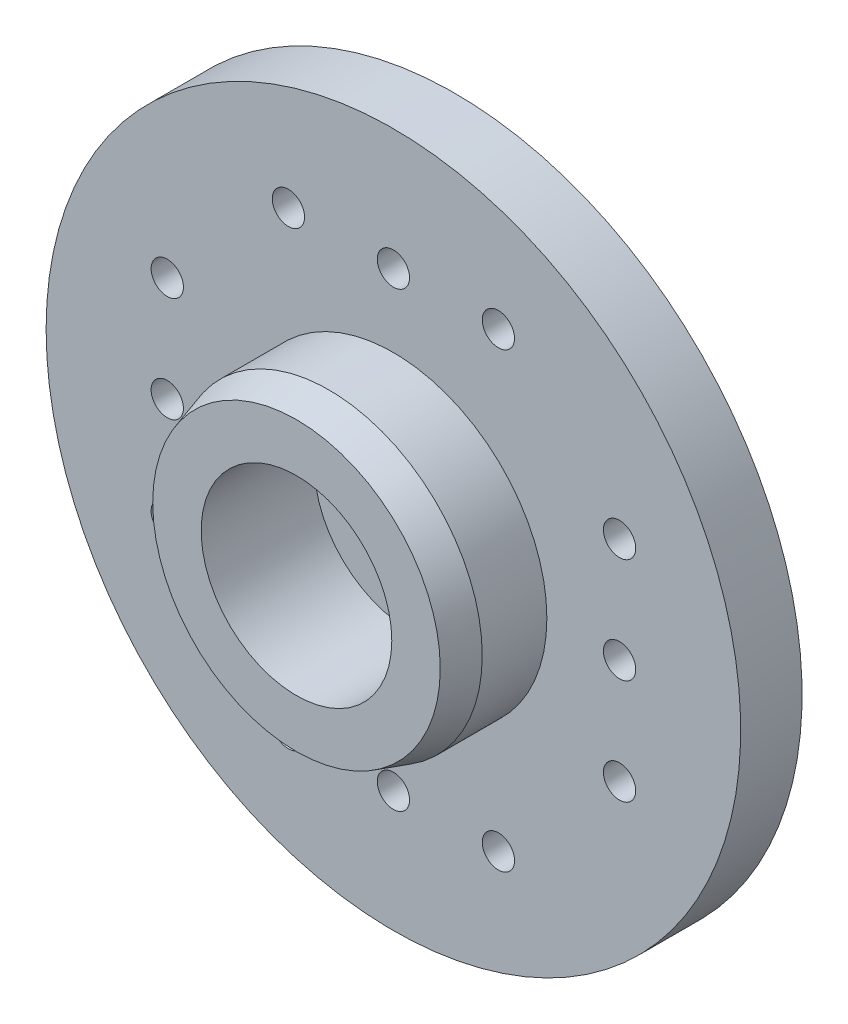
ISO-10303-21;
HEADER;
FILE_DESCRIPTION(('STEP AP214'),'2;1');
FILE_NAME('part.step','',(''),(''),'','','');
FILE_SCHEMA(('AUTOMOTIVE_DESIGN { 1 0 10303 214 1 1 1 1 }'));
ENDSEC;
DATA;
#1=APPLICATION_CONTEXT('core data for automotive mechanical design processes');
#2=APPLICATION_PROTOCOL_DEFINITION('international standard','automotive_design',2000,#1);
#3=PRODUCT_CONTEXT('',#1,'mechanical');
#4=PRODUCT('Part','Part','',(#3));
#5=PRODUCT_RELATED_PRODUCT_CATEGORY('part','',(#4));
#6=PRODUCT_DEFINITION_FORMATION('','',#4);
#7=PRODUCT_DEFINITION_CONTEXT('part definition',#1,'design');
#8=PRODUCT_DEFINITION('design','',#6,#7);
#9=PRODUCT_DEFINITION_SHAPE('','',#8);
#10=(LENGTH_UNIT() NAMED_UNIT(*) SI_UNIT(.MILLI.,.METRE.));
#11=(NAMED_UNIT(*) PLANE_ANGLE_UNIT() SI_UNIT($,.RADIAN.));
#12=(NAMED_UNIT(*) SI_UNIT($,.STERADIAN.) SOLID_ANGLE_UNIT());
#13=UNCERTAINTY_MEASURE_WITH_UNIT(LENGTH_MEASURE(1.E-05),#10,'distance_accuracy_value','');
#14=(GEOMETRIC_REPRESENTATION_CONTEXT(3) GLOBAL_UNCERTAINTY_ASSIGNED_CONTEXT((#13)) GLOBAL_UNIT_ASSIGNED_CONTEXT((#10,
#11,#12)) REPRESENTATION_CONTEXT('',''));
#15=CARTESIAN_POINT('',(0.,0.,0.));
#16=DIRECTION('',(0.,0.,1.));
#17=DIRECTION('',(1.,0.,0.));
#18=AXIS2_PLACEMENT_3D('',#15,#16,#17);
#19=CARTESIAN_POINT('',(0.,0.,0.));
#20=DIRECTION('',(0.,0.,1.));
#21=DIRECTION('',(1.,0.,0.));
#22=AXIS2_PLACEMENT_3D('',#19,#20,#21);
#23=PLANE('',#22);
#24=CARTESIAN_POINT('',(0.,0.,0.));
#25=DIRECTION('',(0.,0.,-1.));
#26=DIRECTION('',(-1.,0.,0.));
#27=AXIS2_PLACEMENT_3D('',#24,#25,#26);
#28=CIRCLE('',#27,4.25);
#29=CARTESIAN_POINT('',(-4.25,0.,0.));
#30=VERTEX_POINT('',#29);
#31=EDGE_CURVE('E140',#30,#30,#28,.T.);
#32=ORIENTED_EDGE('',*,*,#31,.F.);
#33=EDGE_LOOP('',(#32));
#34=FACE_BOUND('',#33,.T.);
#35=CARTESIAN_POINT('',(-6.99999999999931,3.24999999999949,0.));
#36=DIRECTION('',(0.,0.,1.));
#37=DIRECTION('',(1.,0.,0.));
#38=AXIS2_PLACEMENT_3D('',#35,#36,#37);
#39=CIRCLE('',#38,0.500000000000001);
#40=CARTESIAN_POINT('',(-6.49999999999931,3.24999999999949,0.));
#41=VERTEX_POINT('',#40);
#42=EDGE_CURVE('E110',#41,#41,#39,.T.);
#43=ORIENTED_EDGE('',*,*,#42,.T.);
#44=EDGE_LOOP('',(#43));
#45=FACE_BOUND('',#44,.T.);
#46=CARTESIAN_POINT('',(-6.99999999999931,-5.14291058676828E-13,0.));
#47=DIRECTION('',(0.,0.,1.));
#48=DIRECTION('',(1.,0.,0.));
#49=AXIS2_PLACEMENT_3D('',#46,#47,#48);
#50=CIRCLE('',#49,0.500000000000001);
#51=CARTESIAN_POINT('',(-6.4999999999993,-5.14291058676828E-13,0.));
#52=VERTEX_POINT('',#51);
#53=EDGE_CURVE('E104',#52,#52,#50,.T.);
#54=ORIENTED_EDGE('',*,*,#53,.T.);
#55=EDGE_LOOP('',(#54));
#56=FACE_BOUND('',#55,.T.);
#57=CARTESIAN_POINT('',(-6.9999999999993,-3.25000000000051,0.));
#58=DIRECTION('',(0.,0.,1.));
#59=DIRECTION('',(1.,0.,0.));
#60=AXIS2_PLACEMENT_3D('',#57,#58,#59);
#61=CIRCLE('',#60,0.5);
#62=CARTESIAN_POINT('',(-6.4999999999993,-3.25000000000051,0.));
#63=VERTEX_POINT('',#62);
#64=EDGE_CURVE('E98',#63,#63,#61,.T.);
#65=ORIENTED_EDGE('',*,*,#64,.T.);
#66=EDGE_LOOP('',(#65));
#67=FACE_BOUND('',#66,.T.);
#68=CARTESIAN_POINT('',(-3.24999999999879,-6.99999999999982,0.));
#69=DIRECTION('',(0.,0.,1.));
#70=DIRECTION('',(1.,0.,0.));
#71=AXIS2_PLACEMENT_3D('',#68,#69,#70);
#72=CIRCLE('',#71,0.5);
#73=CARTESIAN_POINT('',(-2.74999999999879,-6.99999999999982,0.));
#74=VERTEX_POINT('',#73);
#75=EDGE_CURVE('E92',#74,#74,#72,.T.);
#76=ORIENTED_EDGE('',*,*,#75,.T.);
#77=EDGE_LOOP('',(#76));
#78=FACE_BOUND('',#77,.T.);
#79=CARTESIAN_POINT('',(1.20901357681241E-12,-6.99999999999982,0.));
#80=DIRECTION('',(0.,0.,1.));
#81=DIRECTION('',(1.,0.,0.));
#82=AXIS2_PLACEMENT_3D('',#79,#80,#81);
#83=CIRCLE('',#82,0.5);
#84=CARTESIAN_POINT('',(0.500000000001209,-6.99999999999982,0.));
#85=VERTEX_POINT('',#84);
#86=EDGE_CURVE('E86',#85,#85,#83,.T.);
#87=ORIENTED_EDGE('',*,*,#86,.T.);
#88=EDGE_LOOP('',(#87));
#89=FACE_BOUND('',#88,.T.);
#90=CARTESIAN_POINT('',(3.25000000000121,-6.99999999999982,0.));
#91=DIRECTION('',(0.,0.,1.));
#92=DIRECTION('',(1.,0.,0.));
#93=AXIS2_PLACEMENT_3D('',#90,#91,#92);
#94=CIRCLE('',#93,0.5);
#95=CARTESIAN_POINT('',(3.75000000000121,-6.99999999999982,0.));
#96=VERTEX_POINT('',#95);
#97=EDGE_CURVE('E80',#96,#96,#94,.T.);
#98=ORIENTED_EDGE('',*,*,#97,.T.);
#99=EDGE_LOOP('',(#98));
#100=FACE_BOUND('',#99,.T.);
#101=CARTESIAN_POINT('',(7.00000000000051,-3.2499999999993,0.));
#102=DIRECTION('',(0.,0.,1.));
#103=DIRECTION('',(1.,0.,0.));
#104=AXIS2_PLACEMENT_3D('',#101,#102,#103);
#105=CIRCLE('',#104,0.5);
#106=CARTESIAN_POINT('',(7.50000000000051,-3.2499999999993,0.));
#107=VERTEX_POINT('',#106);
#108=EDGE_CURVE('E74',#107,#107,#105,.T.);
#109=ORIENTED_EDGE('',*,*,#108,.T.);
#110=EDGE_LOOP('',(#109));
#111=FACE_BOUND('',#110,.T.);
#112=CARTESIAN_POINT('',(7.00000000000051,6.9557977089499E-13,0.));
#113=DIRECTION('',(0.,0.,1.));
#114=DIRECTION('',(1.,0.,0.));
#115=AXIS2_PLACEMENT_3D('',#112,#113,#114);
#116=CIRCLE('',#115,0.5);
#117=CARTESIAN_POINT('',(7.50000000000051,6.9557977089499E-13,0.));
#118=VERTEX_POINT('',#117);
#119=EDGE_CURVE('E68',#118,#118,#116,.T.);
#120=ORIENTED_EDGE('',*,*,#119,.T.);
#121=EDGE_LOOP('',(#120));
#122=FACE_BOUND('',#121,.T.);
#123=CARTESIAN_POINT('',(7.00000000000051,3.2500000000007,0.));
#124=DIRECTION('',(0.,0.,1.));
#125=DIRECTION('',(1.,0.,0.));
#126=AXIS2_PLACEMENT_3D('',#123,#124,#125);
#127=CIRCLE('',#126,0.500000000000001);
#128=CARTESIAN_POINT('',(7.50000000000051,3.2500000000007,0.));
#129=VERTEX_POINT('',#128);
#130=EDGE_CURVE('E62',#129,#129,#127,.T.);
#131=ORIENTED_EDGE('',*,*,#130,.T.);
#132=EDGE_LOOP('',(#131));
#133=FACE_BOUND('',#132,.T.);
#134=CARTESIAN_POINT('',(3.25,7.,0.));
#135=DIRECTION('',(0.,0.,1.));
#136=DIRECTION('',(1.,0.,0.));
#137=AXIS2_PLACEMENT_3D('',#134,#135,#136);
#138=CIRCLE('',#137,0.5);
#139=CARTESIAN_POINT('',(3.75,7.,0.));
#140=VERTEX_POINT('',#139);
#141=EDGE_CURVE('E56',#140,#140,#138,.T.);
#142=ORIENTED_EDGE('',*,*,#141,.T.);
#143=EDGE_LOOP('',(#142));
#144=FACE_BOUND('',#143,.T.);
#145=CARTESIAN_POINT('',(0.,7.,0.));
#146=DIRECTION('',(0.,0.,1.));
#147=DIRECTION('',(1.,0.,0.));
#148=AXIS2_PLACEMENT_3D('',#145,#146,#147);
#149=CIRCLE('',#148,0.5);
#150=CARTESIAN_POINT('',(0.5,7.,0.));
#151=VERTEX_POINT('',#150);
#152=EDGE_CURVE('E50',#151,#151,#149,.T.);
#153=ORIENTED_EDGE('',*,*,#152,.T.);
#154=EDGE_LOOP('',(#153));
#155=FACE_BOUND('',#154,.T.);
#156=CARTESIAN_POINT('',(-3.25,7.,0.));
#157=DIRECTION('',(0.,0.,1.));
#158=DIRECTION('',(1.,0.,0.));
#159=AXIS2_PLACEMENT_3D('',#156,#157,#158);
#160=CIRCLE('',#159,0.5);
#161=CARTESIAN_POINT('',(-2.75,7.,0.));
#162=VERTEX_POINT('',#161);
#163=EDGE_CURVE('E44',#162,#162,#160,.T.);
#164=ORIENTED_EDGE('',*,*,#163,.T.);
#165=EDGE_LOOP('',(#164));
#166=FACE_BOUND('',#165,.T.);
#167=CARTESIAN_POINT('',(0.,0.,0.));
#168=DIRECTION('',(0.,0.,1.));
#169=DIRECTION('',(1.,0.,0.));
#170=AXIS2_PLACEMENT_3D('',#167,#168,#169);
#171=CIRCLE('',#170,10.75);
#172=CARTESIAN_POINT('',(-10.75,0.,0.));
#173=VERTEX_POINT('',#172);
#174=EDGE_CURVE('E35',#173,#173,#171,.T.);
#175=ORIENTED_EDGE('',*,*,#174,.F.);
#176=EDGE_LOOP('',(#175));
#177=FACE_BOUND('',#176,.T.);
#178=ADVANCED_FACE('F31',(#34,#45,#56,#67,#78,#89,#100,#111,#122,#133,#144,#155,#166,#177),#23,.F.);
#179=CARTESIAN_POINT('',(0.,0.,1.9));
#180=DIRECTION('',(0.,0.,1.));
#181=DIRECTION('',(1.,0.,0.));
#182=AXIS2_PLACEMENT_3D('',#179,#180,#181);
#183=PLANE('',#182);
#184=CARTESIAN_POINT('',(-6.99999999999931,3.24999999999949,1.9));
#185=DIRECTION('',(0.,0.,1.));
#186=DIRECTION('',(1.,0.,0.));
#187=AXIS2_PLACEMENT_3D('',#184,#185,#186);
#188=CIRCLE('',#187,0.500000000000001);
#189=CARTESIAN_POINT('',(-6.49999999999931,3.24999999999949,1.9));
#190=VERTEX_POINT('',#189);
#191=EDGE_CURVE('E107',#190,#190,#188,.T.);
#192=ORIENTED_EDGE('',*,*,#191,.F.);
#193=EDGE_LOOP('',(#192));
#194=FACE_BOUND('',#193,.T.);
#195=CARTESIAN_POINT('',(-6.9999999999993,-3.25000000000051,1.9));
#196=DIRECTION('',(0.,0.,1.));
#197=DIRECTION('',(1.,0.,0.));
#198=AXIS2_PLACEMENT_3D('',#195,#196,#197);
#199=CIRCLE('',#198,0.5);
#200=CARTESIAN_POINT('',(-6.4999999999993,-3.25000000000051,1.9));
#201=VERTEX_POINT('',#200);
#202=EDGE_CURVE('E95',#201,#201,#199,.T.);
#203=ORIENTED_EDGE('',*,*,#202,.F.);
#204=EDGE_LOOP('',(#203));
#205=FACE_BOUND('',#204,.T.);
#206=CARTESIAN_POINT('',(1.20901357681241E-12,-6.99999999999982,1.9));
#207=DIRECTION('',(0.,0.,1.));
#208=DIRECTION('',(1.,0.,0.));
#209=AXIS2_PLACEMENT_3D('',#206,#207,#208);
#210=CIRCLE('',#209,0.5);
#211=CARTESIAN_POINT('',(0.500000000001209,-6.99999999999982,1.9));
#212=VERTEX_POINT('',#211);
#213=EDGE_CURVE('E83',#212,#212,#210,.T.);
#214=ORIENTED_EDGE('',*,*,#213,.F.);
#215=EDGE_LOOP('',(#214));
#216=FACE_BOUND('',#215,.T.);
#217=CARTESIAN_POINT('',(7.00000000000051,-3.2499999999993,1.9));
#218=DIRECTION('',(0.,0.,1.));
#219=DIRECTION('',(1.,0.,0.));
#220=AXIS2_PLACEMENT_3D('',#217,#218,#219);
#221=CIRCLE('',#220,0.5);
#222=CARTESIAN_POINT('',(7.50000000000051,-3.2499999999993,1.9));
#223=VERTEX_POINT('',#222);
#224=EDGE_CURVE('E71',#223,#223,#221,.T.);
#225=ORIENTED_EDGE('',*,*,#224,.F.);
#226=EDGE_LOOP('',(#225));
#227=FACE_BOUND('',#226,.T.);
#228=CARTESIAN_POINT('',(7.00000000000051,3.2500000000007,1.9));
#229=DIRECTION('',(0.,0.,1.));
#230=DIRECTION('',(1.,0.,0.));
#231=AXIS2_PLACEMENT_3D('',#228,#229,#230);
#232=CIRCLE('',#231,0.500000000000001);
#233=CARTESIAN_POINT('',(7.50000000000051,3.2500000000007,1.9));
#234=VERTEX_POINT('',#233);
#235=EDGE_CURVE('E59',#234,#234,#232,.T.);
#236=ORIENTED_EDGE('',*,*,#235,.F.);
#237=EDGE_LOOP('',(#236));
#238=FACE_BOUND('',#237,.T.);
#239=CARTESIAN_POINT('',(0.,7.,1.9));
#240=DIRECTION('',(0.,0.,1.));
#241=DIRECTION('',(1.,0.,0.));
#242=AXIS2_PLACEMENT_3D('',#239,#240,#241);
#243=CIRCLE('',#242,0.5);
#244=CARTESIAN_POINT('',(0.5,7.,1.9));
#245=VERTEX_POINT('',#244);
#246=EDGE_CURVE('E47',#245,#245,#243,.T.);
#247=ORIENTED_EDGE('',*,*,#246,.F.);
#248=EDGE_LOOP('',(#247));
#249=FACE_BOUND('',#248,.T.);
#250=CARTESIAN_POINT('',(0.,0.,1.9));
#251=DIRECTION('',(0.,0.,1.));
#252=DIRECTION('',(1.,0.,0.));
#253=AXIS2_PLACEMENT_3D('',#250,#251,#252);
#254=CIRCLE('',#253,10.75);
#255=CARTESIAN_POINT('',(-10.75,0.,1.9));
#256=VERTEX_POINT('',#255);
#257=EDGE_CURVE('E10',#256,#256,#254,.T.);
#258=ORIENTED_EDGE('',*,*,#257,.T.);
#259=EDGE_LOOP('',(#258));
#260=FACE_BOUND('',#259,.T.);
#261=CARTESIAN_POINT('',(-3.25,7.,1.9));
#262=DIRECTION('',(0.,0.,1.));
#263=DIRECTION('',(1.,0.,0.));
#264=AXIS2_PLACEMENT_3D('',#261,#262,#263);
#265=CIRCLE('',#264,0.5);
#266=CARTESIAN_POINT('',(-2.75,7.,1.9));
#267=VERTEX_POINT('',#266);
#268=EDGE_CURVE('E42',#267,#267,#265,.T.);
#269=ORIENTED_EDGE('',*,*,#268,.F.);
#270=EDGE_LOOP('',(#269));
#271=FACE_BOUND('',#270,.T.);
#272=CARTESIAN_POINT('',(3.25,7.,1.9));
#273=DIRECTION('',(0.,0.,1.));
#274=DIRECTION('',(1.,0.,0.));
#275=AXIS2_PLACEMENT_3D('',#272,#273,#274);
#276=CIRCLE('',#275,0.5);
#277=CARTESIAN_POINT('',(3.75,7.,1.9));
#278=VERTEX_POINT('',#277);
#279=EDGE_CURVE('E53',#278,#278,#276,.T.);
#280=ORIENTED_EDGE('',*,*,#279,.F.);
#281=EDGE_LOOP('',(#280));
#282=FACE_BOUND('',#281,.T.);
#283=CARTESIAN_POINT('',(7.00000000000051,6.9557977089499E-13,1.9));
#284=DIRECTION('',(0.,0.,1.));
#285=DIRECTION('',(1.,0.,0.));
#286=AXIS2_PLACEMENT_3D('',#283,#284,#285);
#287=CIRCLE('',#286,0.5);
#288=CARTESIAN_POINT('',(7.50000000000051,6.9557977089499E-13,1.9));
#289=VERTEX_POINT('',#288);
#290=EDGE_CURVE('E65',#289,#289,#287,.T.);
#291=ORIENTED_EDGE('',*,*,#290,.F.);
#292=EDGE_LOOP('',(#291));
#293=FACE_BOUND('',#292,.T.);
#294=CARTESIAN_POINT('',(3.25000000000121,-6.99999999999982,1.9));
#295=DIRECTION('',(0.,0.,1.));
#296=DIRECTION('',(1.,0.,0.));
#297=AXIS2_PLACEMENT_3D('',#294,#295,#296);
#298=CIRCLE('',#297,0.5);
#299=CARTESIAN_POINT('',(3.75000000000121,-6.99999999999982,1.9));
#300=VERTEX_POINT('',#299);
#301=EDGE_CURVE('E77',#300,#300,#298,.T.);
#302=ORIENTED_EDGE('',*,*,#301,.F.);
#303=EDGE_LOOP('',(#302));
#304=FACE_BOUND('',#303,.T.);
#305=CARTESIAN_POINT('',(-3.24999999999879,-6.99999999999982,1.9));
#306=DIRECTION('',(0.,0.,1.));
#307=DIRECTION('',(1.,0.,0.));
#308=AXIS2_PLACEMENT_3D('',#305,#306,#307);
#309=CIRCLE('',#308,0.5);
#310=CARTESIAN_POINT('',(-2.74999999999879,-6.99999999999982,1.9));
#311=VERTEX_POINT('',#310);
#312=EDGE_CURVE('E89',#311,#311,#309,.T.);
#313=ORIENTED_EDGE('',*,*,#312,.F.);
#314=EDGE_LOOP('',(#313));
#315=FACE_BOUND('',#314,.T.);
#316=CARTESIAN_POINT('',(-6.99999999999931,-5.14291058676828E-13,1.9));
#317=DIRECTION('',(0.,0.,1.));
#318=DIRECTION('',(1.,0.,0.));
#319=AXIS2_PLACEMENT_3D('',#316,#317,#318);
#320=CIRCLE('',#319,0.500000000000001);
#321=CARTESIAN_POINT('',(-6.4999999999993,-5.14291058676828E-13,1.9));
#322=VERTEX_POINT('',#321);
#323=EDGE_CURVE('E101',#322,#322,#320,.T.);
#324=ORIENTED_EDGE('',*,*,#323,.F.);
#325=EDGE_LOOP('',(#324));
#326=FACE_BOUND('',#325,.T.);
#327=CARTESIAN_POINT('',(0.,0.,1.9));
#328=DIRECTION('',(0.,0.,1.));
#329=DIRECTION('',(1.,0.,0.));
#330=AXIS2_PLACEMENT_3D('',#327,#328,#329);
#331=CIRCLE('',#330,4.75);
#332=CARTESIAN_POINT('',(4.75,0.,1.9));
#333=VERTEX_POINT('',#332);
#334=EDGE_CURVE('E113',#333,#333,#331,.T.);
#335=ORIENTED_EDGE('',*,*,#334,.F.);
#336=EDGE_LOOP('',(#335));
#337=FACE_BOUND('',#336,.T.);
#338=ADVANCED_FACE('F176',(#194,#205,#216,#227,#238,#249,#260,#271,#282,#293,#304,#315,#326,
#337),#183,.T.);
#339=CARTESIAN_POINT('',(0.,0.,1.9));
#340=DIRECTION('',(0.,0.,-1.));
#341=DIRECTION('',(-1.,0.,0.));
#342=AXIS2_PLACEMENT_3D('',#339,#340,#341);
#343=CYLINDRICAL_SURFACE('',#342,10.75);
#344=CARTESIAN_POINT('',(-10.75,0.,1.9));
#345=CARTESIAN_POINT('',(-10.75,0.,1.88020833333333));
#346=CARTESIAN_POINT('',(-10.75,0.,1.86041666666667));
#347=CARTESIAN_POINT('',(-10.75,0.,1.82083333333333));
#348=CARTESIAN_POINT('',(-10.75,0.,1.80104166666667));
#349=CARTESIAN_POINT('',(-10.75,0.,1.76145833333333));
#350=CARTESIAN_POINT('',(-10.75,0.,1.74166666666667));
#351=CARTESIAN_POINT('',(-10.75,0.,1.70208333333333));
#352=CARTESIAN_POINT('',(-10.75,0.,1.68229166666667));
#353=CARTESIAN_POINT('',(-10.75,0.,1.64270833333333));
#354=CARTESIAN_POINT('',(-10.75,0.,1.62291666666667));
#355=CARTESIAN_POINT('',(-10.75,0.,1.58333333333333));
#356=CARTESIAN_POINT('',(-10.75,0.,1.56354166666667));
#357=CARTESIAN_POINT('',(-10.75,0.,1.52395833333333));
#358=CARTESIAN_POINT('',(-10.75,0.,1.50416666666667));
#359=CARTESIAN_POINT('',(-10.75,0.,1.46458333333333));
#360=CARTESIAN_POINT('',(-10.75,0.,1.44479166666667));
#361=CARTESIAN_POINT('',(-10.75,0.,1.40520833333333));
#362=CARTESIAN_POINT('',(-10.75,0.,1.38541666666667));
#363=CARTESIAN_POINT('',(-10.75,0.,1.34583333333333));
#364=CARTESIAN_POINT('',(-10.75,0.,1.32604166666667));
#365=CARTESIAN_POINT('',(-10.75,0.,1.28645833333333));
#366=CARTESIAN_POINT('',(-10.75,0.,1.26666666666667));
#367=CARTESIAN_POINT('',(-10.75,0.,1.22708333333333));
#368=CARTESIAN_POINT('',(-10.75,0.,1.20729166666667));
#369=CARTESIAN_POINT('',(-10.75,0.,1.16770833333333));
#370=CARTESIAN_POINT('',(-10.75,0.,1.14791666666667));
#371=CARTESIAN_POINT('',(-10.75,0.,1.10833333333333));
#372=CARTESIAN_POINT('',(-10.75,0.,1.08854166666667));
#373=CARTESIAN_POINT('',(-10.75,0.,1.04895833333333));
#374=CARTESIAN_POINT('',(-10.75,0.,1.02916666666667));
#375=CARTESIAN_POINT('',(-10.75,0.,0.989583333333333));
#376=CARTESIAN_POINT('',(-10.75,0.,0.969791666666666));
#377=CARTESIAN_POINT('',(-10.75,0.,0.930208333333333));
#378=CARTESIAN_POINT('',(-10.75,0.,0.910416666666667));
#379=CARTESIAN_POINT('',(-10.75,0.,0.870833333333333));
#380=CARTESIAN_POINT('',(-10.75,0.,0.851041666666667));
#381=CARTESIAN_POINT('',(-10.75,0.,0.811458333333333));
#382=CARTESIAN_POINT('',(-10.75,0.,0.791666666666667));
#383=CARTESIAN_POINT('',(-10.75,0.,0.752083333333333));
#384=CARTESIAN_POINT('',(-10.75,0.,0.732291666666667));
#385=CARTESIAN_POINT('',(-10.75,0.,0.692708333333333));
#386=CARTESIAN_POINT('',(-10.75,0.,0.672916666666667));
#387=CARTESIAN_POINT('',(-10.75,0.,0.633333333333333));
#388=CARTESIAN_POINT('',(-10.75,0.,0.613541666666667));
#389=CARTESIAN_POINT('',(-10.75,0.,0.573958333333333));
#390=CARTESIAN_POINT('',(-10.75,0.,0.554166666666667));
#391=CARTESIAN_POINT('',(-10.75,0.,0.514583333333334));
#392=CARTESIAN_POINT('',(-10.75,0.,0.494791666666667));
#393=CARTESIAN_POINT('',(-10.75,0.,0.455208333333333));
#394=CARTESIAN_POINT('',(-10.75,0.,0.435416666666667));
#395=CARTESIAN_POINT('',(-10.75,0.,0.395833333333333));
#396=CARTESIAN_POINT('',(-10.75,0.,0.376041666666667));
#397=CARTESIAN_POINT('',(-10.75,0.,0.336458333333333));
#398=CARTESIAN_POINT('',(-10.75,0.,0.316666666666667));
#399=CARTESIAN_POINT('',(-10.75,0.,0.277083333333333));
#400=CARTESIAN_POINT('',(-10.75,0.,0.257291666666667));
#401=CARTESIAN_POINT('',(-10.75,0.,0.217708333333333));
#402=CARTESIAN_POINT('',(-10.75,0.,0.197916666666667));
#403=CARTESIAN_POINT('',(-10.75,0.,0.158333333333333));
#404=CARTESIAN_POINT('',(-10.75,0.,0.138541666666667));
#405=CARTESIAN_POINT('',(-10.75,0.,0.0989583333333333));
#406=CARTESIAN_POINT('',(-10.75,0.,0.0791666666666666));
#407=CARTESIAN_POINT('',(-10.75,0.,0.0395833333333333));
#408=CARTESIAN_POINT('',(-10.75,0.,0.0197916666666666));
#409=CARTESIAN_POINT('',(-10.75,0.,0.));
#410=B_SPLINE_CURVE_WITH_KNOTS('',3,(#344,#345,#346,#347,#348,#349,#350,#351,#352,#353,#354,
#355,#356,#357,#358,#359,#360,#361,#362,#363,#364,#365,#366,#367,#368,#369,#370,#371,#372,#373,
#374,#375,#376,#377,#378,#379,#380,#381,#382,#383,#384,#385,#386,#387,#388,#389,#390,#391,#392,
#393,#394,#395,#396,#397,#398,#399,#400,#401,#402,#403,#404,#405,#406,#407,#408,#409),
.UNSPECIFIED.,.F.,.F.,(4,2,2,2,2,2,2,2,2,2,2,2,2,2,2,2,2,2,2,2,2,2,2,2,2,2,2,2,2,2,2,2,4),(0.,
0.0593750000000002,0.11875,0.178125,0.2375,0.296875,0.35625,0.415625,0.475,0.534375,0.59375,
0.653125,0.7125,0.771875,0.83125,0.890625,0.95,1.009375,1.06875,1.128125,1.1875,1.246875,
1.30625,1.365625,1.425,1.484375,1.54375,1.603125,1.6625,1.721875,1.78125,1.840625,1.9),.UNSPECIFIED.);
#411=EDGE_CURVE('BSEAM33',#256,#173,#410,.T.);
#412=ORIENTED_EDGE('',*,*,#257,.F.);
#413=ORIENTED_EDGE('',*,*,#174,.T.);
#414=ORIENTED_EDGE('',*,*,#411,.T.);
#415=ORIENTED_EDGE('',*,*,#411,.F.);
#416=EDGE_LOOP('',(#412,#414,#413,#415));
#417=FACE_BOUND('',#416,.T.);
#418=ADVANCED_FACE('F33',(#417),#343,.T.);
#419=CARTESIAN_POINT('',(-3.25,7.,1.9));
#420=DIRECTION('',(0.,0.,-1.));
#421=DIRECTION('',(-1.,0.,0.));
#422=AXIS2_PLACEMENT_3D('',#419,#420,#421);
#423=CYLINDRICAL_SURFACE('',#422,0.5);
#424=ORIENTED_EDGE('',*,*,#268,.T.);
#425=EDGE_LOOP('',(#424));
#426=FACE_BOUND('',#425,.T.);
#427=ORIENTED_EDGE('',*,*,#163,.F.);
#428=EDGE_LOOP('',(#427));
#429=FACE_BOUND('',#428,.T.);
#430=ADVANCED_FACE('F186',(#426,#429),#423,.F.);
#431=CARTESIAN_POINT('',(0.,7.,1.9));
#432=DIRECTION('',(0.,0.,-1.));
#433=DIRECTION('',(-1.,0.,0.));
#434=AXIS2_PLACEMENT_3D('',#431,#432,#433);
#435=CYLINDRICAL_SURFACE('',#434,0.5);
#436=ORIENTED_EDGE('',*,*,#246,.T.);
#437=EDGE_LOOP('',(#436));
#438=FACE_BOUND('',#437,.T.);
#439=ORIENTED_EDGE('',*,*,#152,.F.);
#440=EDGE_LOOP('',(#439));
#441=FACE_BOUND('',#440,.T.);
#442=ADVANCED_FACE('F189',(#438,#441),#435,.F.);
#443=CARTESIAN_POINT('',(3.25,7.,1.9));
#444=DIRECTION('',(0.,0.,-1.));
#445=DIRECTION('',(-1.,0.,0.));
#446=AXIS2_PLACEMENT_3D('',#443,#444,#445);
#447=CYLINDRICAL_SURFACE('',#446,0.5);
#448=ORIENTED_EDGE('',*,*,#279,.T.);
#449=EDGE_LOOP('',(#448));
#450=FACE_BOUND('',#449,.T.);
#451=ORIENTED_EDGE('',*,*,#141,.F.);
#452=EDGE_LOOP('',(#451));
#453=FACE_BOUND('',#452,.T.);
#454=ADVANCED_FACE('F193',(#450,#453),#447,.F.);
#455=CARTESIAN_POINT('',(7.00000000000051,3.2500000000007,1.9));
#456=DIRECTION('',(0.,0.,-1.));
#457=DIRECTION('',(-1.,0.,0.));
#458=AXIS2_PLACEMENT_3D('',#455,#456,#457);
#459=CYLINDRICAL_SURFACE('',#458,0.500000000000001);
#460=ORIENTED_EDGE('',*,*,#235,.T.);
#461=EDGE_LOOP('',(#460));
#462=FACE_BOUND('',#461,.T.);
#463=ORIENTED_EDGE('',*,*,#130,.F.);
#464=EDGE_LOOP('',(#463));
#465=FACE_BOUND('',#464,.T.);
#466=ADVANCED_FACE('F197',(#462,#465),#459,.F.);
#467=CARTESIAN_POINT('',(7.00000000000051,6.9557977089499E-13,1.9));
#468=DIRECTION('',(0.,0.,-1.));
#469=DIRECTION('',(-1.,0.,0.));
#470=AXIS2_PLACEMENT_3D('',#467,#468,#469);
#471=CYLINDRICAL_SURFACE('',#470,0.5);
#472=ORIENTED_EDGE('',*,*,#290,.T.);
#473=EDGE_LOOP('',(#472));
#474=FACE_BOUND('',#473,.T.);
#475=ORIENTED_EDGE('',*,*,#119,.F.);
#476=EDGE_LOOP('',(#475));
#477=FACE_BOUND('',#476,.T.);
#478=ADVANCED_FACE('F201',(#474,#477),#471,.F.);
#479=CARTESIAN_POINT('',(7.00000000000051,-3.2499999999993,1.9));
#480=DIRECTION('',(0.,0.,-1.));
#481=DIRECTION('',(-1.,0.,0.));
#482=AXIS2_PLACEMENT_3D('',#479,#480,#481);
#483=CYLINDRICAL_SURFACE('',#482,0.5);
#484=ORIENTED_EDGE('',*,*,#224,.T.);
#485=EDGE_LOOP('',(#484));
#486=FACE_BOUND('',#485,.T.);
#487=ORIENTED_EDGE('',*,*,#108,.F.);
#488=EDGE_LOOP('',(#487));
#489=FACE_BOUND('',#488,.T.);
#490=ADVANCED_FACE('F205',(#486,#489),#483,.F.);
#491=CARTESIAN_POINT('',(3.25000000000121,-6.99999999999982,1.9));
#492=DIRECTION('',(0.,0.,-1.));
#493=DIRECTION('',(-1.,0.,0.));
#494=AXIS2_PLACEMENT_3D('',#491,#492,#493);
#495=CYLINDRICAL_SURFACE('',#494,0.5);
#496=ORIENTED_EDGE('',*,*,#301,.T.);
#497=EDGE_LOOP('',(#496));
#498=FACE_BOUND('',#497,.T.);
#499=ORIENTED_EDGE('',*,*,#97,.F.);
#500=EDGE_LOOP('',(#499));
#501=FACE_BOUND('',#500,.T.);
#502=ADVANCED_FACE('F209',(#498,#501),#495,.F.);
#503=CARTESIAN_POINT('',(1.20901357681241E-12,-6.99999999999982,1.9));
#504=DIRECTION('',(0.,0.,-1.));
#505=DIRECTION('',(-1.,0.,0.));
#506=AXIS2_PLACEMENT_3D('',#503,#504,#505);
#507=CYLINDRICAL_SURFACE('',#506,0.5);
#508=ORIENTED_EDGE('',*,*,#213,.T.);
#509=EDGE_LOOP('',(#508));
#510=FACE_BOUND('',#509,.T.);
#511=ORIENTED_EDGE('',*,*,#86,.F.);
#512=EDGE_LOOP('',(#511));
#513=FACE_BOUND('',#512,.T.);
#514=ADVANCED_FACE('F213',(#510,#513),#507,.F.);
#515=CARTESIAN_POINT('',(-3.24999999999879,-6.99999999999982,1.9));
#516=DIRECTION('',(0.,0.,-1.));
#517=DIRECTION('',(-1.,0.,0.));
#518=AXIS2_PLACEMENT_3D('',#515,#516,#517);
#519=CYLINDRICAL_SURFACE('',#518,0.5);
#520=ORIENTED_EDGE('',*,*,#312,.T.);
#521=EDGE_LOOP('',(#520));
#522=FACE_BOUND('',#521,.T.);
#523=ORIENTED_EDGE('',*,*,#75,.F.);
#524=EDGE_LOOP('',(#523));
#525=FACE_BOUND('',#524,.T.);
#526=ADVANCED_FACE('F217',(#522,#525),#519,.F.);
#527=CARTESIAN_POINT('',(-6.9999999999993,-3.25000000000051,1.9));
#528=DIRECTION('',(0.,0.,-1.));
#529=DIRECTION('',(-1.,0.,0.));
#530=AXIS2_PLACEMENT_3D('',#527,#528,#529);
#531=CYLINDRICAL_SURFACE('',#530,0.5);
#532=ORIENTED_EDGE('',*,*,#202,.T.);
#533=EDGE_LOOP('',(#532));
#534=FACE_BOUND('',#533,.T.);
#535=ORIENTED_EDGE('',*,*,#64,.F.);
#536=EDGE_LOOP('',(#535));
#537=FACE_BOUND('',#536,.T.);
#538=ADVANCED_FACE('F221',(#534,#537),#531,.F.);
#539=CARTESIAN_POINT('',(-6.99999999999931,-5.14291058676828E-13,1.9));
#540=DIRECTION('',(0.,0.,-1.));
#541=DIRECTION('',(-1.,0.,0.));
#542=AXIS2_PLACEMENT_3D('',#539,#540,#541);
#543=CYLINDRICAL_SURFACE('',#542,0.500000000000001);
#544=ORIENTED_EDGE('',*,*,#323,.T.);
#545=EDGE_LOOP('',(#544));
#546=FACE_BOUND('',#545,.T.);
#547=ORIENTED_EDGE('',*,*,#53,.F.);
#548=EDGE_LOOP('',(#547));
#549=FACE_BOUND('',#548,.T.);
#550=ADVANCED_FACE('F225',(#546,#549),#543,.F.);
#551=CARTESIAN_POINT('',(-6.99999999999931,3.24999999999949,1.9));
#552=DIRECTION('',(0.,0.,-1.));
#553=DIRECTION('',(-1.,0.,0.));
#554=AXIS2_PLACEMENT_3D('',#551,#552,#553);
#555=CYLINDRICAL_SURFACE('',#554,0.500000000000001);
#556=ORIENTED_EDGE('',*,*,#191,.T.);
#557=EDGE_LOOP('',(#556));
#558=FACE_BOUND('',#557,.T.);
#559=ORIENTED_EDGE('',*,*,#42,.F.);
#560=EDGE_LOOP('',(#559));
#561=FACE_BOUND('',#560,.T.);
#562=ADVANCED_FACE('F229',(#558,#561),#555,.F.);
#563=CARTESIAN_POINT('',(0.,0.,4.9));
#564=DIRECTION('',(0.,0.,-1.));
#565=DIRECTION('',(-1.,0.,0.));
#566=AXIS2_PLACEMENT_3D('',#563,#564,#565);
#567=CYLINDRICAL_SURFACE('',#566,4.75);
#568=CARTESIAN_POINT('',(0.,0.,3.9));
#569=DIRECTION('',(0.,0.,1.));
#570=DIRECTION('',(1.,0.,0.));
#571=AXIS2_PLACEMENT_3D('',#568,#569,#570);
#572=CIRCLE('',#571,4.75);
#573=CARTESIAN_POINT('',(4.75,0.,3.9));
#574=VERTEX_POINT('',#573);
#575=EDGE_CURVE('E121',#574,#574,#572,.T.);
#576=ORIENTED_EDGE('',*,*,#575,.F.);
#577=EDGE_LOOP('',(#576));
#578=FACE_BOUND('',#577,.T.);
#579=ORIENTED_EDGE('',*,*,#334,.T.);
#580=EDGE_LOOP('',(#579));
#581=FACE_BOUND('',#580,.T.);
#582=ADVANCED_FACE('F233',(#578,#581),#567,.T.);
#583=CARTESIAN_POINT('',(0.,0.,3.9));
#584=DIRECTION('',(0.,0.,-1.));
#585=DIRECTION('',(-1.,0.,0.));
#586=AXIS2_PLACEMENT_3D('',#583,#584,#585);
#587=CONICAL_SURFACE('',#586,4.75,0.291456794477867);
#588=CARTESIAN_POINT('',(0.,0.,4.9));
#589=DIRECTION('',(0.,0.,1.));
#590=DIRECTION('',(1.,0.,0.));
#591=AXIS2_PLACEMENT_3D('',#588,#589,#590);
#592=CIRCLE('',#591,4.45);
#593=CARTESIAN_POINT('',(4.45,0.,4.9));
#594=VERTEX_POINT('',#593);
#595=EDGE_CURVE('E118',#594,#594,#592,.T.);
#596=ORIENTED_EDGE('',*,*,#595,.F.);
#597=EDGE_LOOP('',(#596));
#598=FACE_BOUND('',#597,.T.);
#599=ORIENTED_EDGE('',*,*,#575,.T.);
#600=EDGE_LOOP('',(#599));
#601=FACE_BOUND('',#600,.T.);
#602=ADVANCED_FACE('F237',(#598,#601),#587,.T.);
#603=CARTESIAN_POINT('',(0.,0.,4.9));
#604=DIRECTION('',(0.,0.,1.));
#605=DIRECTION('',(1.,0.,0.));
#606=AXIS2_PLACEMENT_3D('',#603,#604,#605);
#607=PLANE('',#606);
#608=CARTESIAN_POINT('',(0.,0.,4.9));
#609=DIRECTION('',(0.,0.,1.));
#610=DIRECTION('',(1.,0.,0.));
#611=AXIS2_PLACEMENT_3D('',#608,#609,#610);
#612=CIRCLE('',#611,2.95);
#613=CARTESIAN_POINT('',(2.95,0.,4.9));
#614=VERTEX_POINT('',#613);
#615=EDGE_CURVE('E125',#614,#614,#612,.T.);
#616=ORIENTED_EDGE('',*,*,#615,.F.);
#617=EDGE_LOOP('',(#616));
#618=FACE_BOUND('',#617,.T.);
#619=ORIENTED_EDGE('',*,*,#595,.T.);
#620=EDGE_LOOP('',(#619));
#621=FACE_BOUND('',#620,.T.);
#622=ADVANCED_FACE('F239',(#618,#621),#607,.T.);
#623=CARTESIAN_POINT('',(0.,0.,1.4));
#624=DIRECTION('',(0.,0.,1.));
#625=DIRECTION('',(1.,0.,0.));
#626=AXIS2_PLACEMENT_3D('',#623,#624,#625);
#627=CYLINDRICAL_SURFACE('',#626,2.95);
#628=CARTESIAN_POINT('',(0.,0.,1.4));
#629=DIRECTION('',(0.,0.,1.));
#630=DIRECTION('',(1.,0.,0.));
#631=AXIS2_PLACEMENT_3D('',#628,#629,#630);
#632=CIRCLE('',#631,2.95);
#633=CARTESIAN_POINT('',(2.95,0.,1.4));
#634=VERTEX_POINT('',#633);
#635=EDGE_CURVE('E124',#634,#634,#632,.T.);
#636=ORIENTED_EDGE('',*,*,#635,.F.);
#637=EDGE_LOOP('',(#636));
#638=FACE_BOUND('',#637,.T.);
#639=ORIENTED_EDGE('',*,*,#615,.T.);
#640=EDGE_LOOP('',(#639));
#641=FACE_BOUND('',#640,.T.);
#642=ADVANCED_FACE('F242',(#638,#641),#627,.F.);
#643=CARTESIAN_POINT('',(0.,0.,1.4));
#644=DIRECTION('',(0.,0.,1.));
#645=DIRECTION('',(1.,0.,0.));
#646=AXIS2_PLACEMENT_3D('',#643,#644,#645);
#647=PLANE('',#646);
#648=CARTESIAN_POINT('',(0.,0.,1.4));
#649=DIRECTION('',(0.,0.,1.));
#650=DIRECTION('',(1.,0.,0.));
#651=AXIS2_PLACEMENT_3D('',#648,#649,#650);
#652=CIRCLE('',#651,1.45);
#653=CARTESIAN_POINT('',(1.45,0.,1.4));
#654=VERTEX_POINT('',#653);
#655=EDGE_CURVE('E148',#654,#654,#652,.T.);
#656=ORIENTED_EDGE('',*,*,#655,.F.);
#657=EDGE_LOOP('',(#656));
#658=FACE_BOUND('',#657,.T.);
#659=ORIENTED_EDGE('',*,*,#635,.T.);
#660=EDGE_LOOP('',(#659));
#661=FACE_BOUND('',#660,.T.);
#662=ADVANCED_FACE('F249',(#658,#661),#647,.T.);
#663=CARTESIAN_POINT('',(0.,0.,0.4));
#664=DIRECTION('',(0.,0.,-1.));
#665=DIRECTION('',(-1.,0.,0.));
#666=AXIS2_PLACEMENT_3D('',#663,#664,#665);
#667=CYLINDRICAL_SURFACE('',#666,4.25);
#668=CARTESIAN_POINT('',(0.,0.,0.4));
#669=DIRECTION('',(0.,0.,-1.));
#670=DIRECTION('',(-1.,0.,0.));
#671=AXIS2_PLACEMENT_3D('',#668,#669,#670);
#672=CIRCLE('',#671,4.25);
#673=CARTESIAN_POINT('',(-4.25,0.,0.4));
#674=VERTEX_POINT('',#673);
#675=EDGE_CURVE('E137',#674,#674,#672,.T.);
#676=ORIENTED_EDGE('',*,*,#675,.F.);
#677=EDGE_LOOP('',(#676));
#678=FACE_BOUND('',#677,.T.);
#679=ORIENTED_EDGE('',*,*,#31,.T.);
#680=EDGE_LOOP('',(#679));
#681=FACE_BOUND('',#680,.T.);
#682=ADVANCED_FACE('F253',(#678,#681),#667,.F.);
#683=CARTESIAN_POINT('',(0.,0.,0.4));
#684=DIRECTION('',(0.,0.,-1.));
#685=DIRECTION('',(-1.,0.,0.));
#686=AXIS2_PLACEMENT_3D('',#683,#684,#685);
#687=PLANE('',#686);
#688=CARTESIAN_POINT('',(0.,0.,0.4));
#689=DIRECTION('',(0.,0.,-1.));
#690=DIRECTION('',(-1.,0.,0.));
#691=AXIS2_PLACEMENT_3D('',#688,#689,#690);
#692=CIRCLE('',#691,3.25);
#693=CARTESIAN_POINT('',(-3.25,0.,0.4));
#694=VERTEX_POINT('',#693);
#695=EDGE_CURVE('E143',#694,#694,#692,.T.);
#696=ORIENTED_EDGE('',*,*,#695,.F.);
#697=EDGE_LOOP('',(#696));
#698=FACE_BOUND('',#697,.T.);
#699=ORIENTED_EDGE('',*,*,#675,.T.);
#700=EDGE_LOOP('',(#699));
#701=FACE_BOUND('',#700,.T.);
#702=ADVANCED_FACE('F161',(#698,#701),#687,.T.);
#703=CARTESIAN_POINT('',(0.,0.,0.));
#704=DIRECTION('',(0.,0.,-1.));
#705=DIRECTION('',(-1.,0.,0.));
#706=AXIS2_PLACEMENT_3D('',#703,#704,#705);
#707=CIRCLE('',#706,1.45);
#708=CARTESIAN_POINT('',(-1.45,0.,0.));
#709=VERTEX_POINT('',#708);
#710=EDGE_CURVE('E151',#709,#709,#707,.T.);
#711=ORIENTED_EDGE('',*,*,#710,.F.);
#712=EDGE_LOOP('',(#711));
#713=FACE_BOUND('',#712,.T.);
#714=CARTESIAN_POINT('',(0.,0.,0.));
#715=DIRECTION('',(0.,0.,-1.));
#716=DIRECTION('',(-1.,0.,0.));
#717=AXIS2_PLACEMENT_3D('',#714,#715,#716);
#718=CIRCLE('',#717,2.75);
#719=CARTESIAN_POINT('',(-2.75,0.,0.));
#720=VERTEX_POINT('',#719);
#721=EDGE_CURVE('E134',#720,#720,#718,.T.);
#722=ORIENTED_EDGE('',*,*,#721,.T.);
#723=EDGE_LOOP('',(#722));
#724=FACE_BOUND('',#723,.T.);
#725=ADVANCED_FACE('F157',(#713,#724),#23,.F.);
#726=CARTESIAN_POINT('',(0.,0.,-1.));
#727=DIRECTION('',(0.,0.,1.));
#728=DIRECTION('',(1.,0.,0.));
#729=AXIS2_PLACEMENT_3D('',#726,#727,#728);
#730=CYLINDRICAL_SURFACE('',#729,2.75);
#731=CARTESIAN_POINT('',(0.,0.,-1.));
#732=DIRECTION('',(0.,0.,-1.));
#733=DIRECTION('',(-1.,0.,0.));
#734=AXIS2_PLACEMENT_3D('',#731,#732,#733);
#735=CIRCLE('',#734,2.75);
#736=CARTESIAN_POINT('',(-2.75,0.,-1.));
#737=VERTEX_POINT('',#736);
#738=EDGE_CURVE('E133',#737,#737,#735,.T.);
#739=ORIENTED_EDGE('',*,*,#738,.T.);
#740=EDGE_LOOP('',(#739));
#741=FACE_BOUND('',#740,.T.);
#742=ORIENTED_EDGE('',*,*,#721,.F.);
#743=EDGE_LOOP('',(#742));
#744=FACE_BOUND('',#743,.T.);
#745=ADVANCED_FACE('F160',(#741,#744),#730,.F.);
#746=CARTESIAN_POINT('',(0.,0.,-1.));
#747=DIRECTION('',(0.,0.,-1.));
#748=DIRECTION('',(-1.,0.,0.));
#749=AXIS2_PLACEMENT_3D('',#746,#747,#748);
#750=PLANE('',#749);
#751=CARTESIAN_POINT('',(0.,0.,-1.));
#752=DIRECTION('',(0.,0.,-1.));
#753=DIRECTION('',(-1.,0.,0.));
#754=AXIS2_PLACEMENT_3D('',#751,#752,#753);
#755=CIRCLE('',#754,3.25);
#756=CARTESIAN_POINT('',(-3.25,0.,-1.));
#757=VERTEX_POINT('',#756);
#758=EDGE_CURVE('E128',#757,#757,#755,.T.);
#759=ORIENTED_EDGE('',*,*,#758,.T.);
#760=EDGE_LOOP('',(#759));
#761=FACE_BOUND('',#760,.T.);
#762=ORIENTED_EDGE('',*,*,#738,.F.);
#763=EDGE_LOOP('',(#762));
#764=FACE_BOUND('',#763,.T.);
#765=ADVANCED_FACE('F165',(#761,#764),#750,.T.);
#766=CARTESIAN_POINT('',(0.,0.,-1.));
#767=DIRECTION('',(0.,0.,1.));
#768=DIRECTION('',(1.,0.,0.));
#769=AXIS2_PLACEMENT_3D('',#766,#767,#768);
#770=CYLINDRICAL_SURFACE('',#769,3.25);
#771=ORIENTED_EDGE('',*,*,#758,.F.);
#772=EDGE_LOOP('',(#771));
#773=FACE_BOUND('',#772,.T.);
#774=ORIENTED_EDGE('',*,*,#695,.T.);
#775=EDGE_LOOP('',(#774));
#776=FACE_BOUND('',#775,.T.);
#777=ADVANCED_FACE('F171',(#773,#776),#770,.T.);
#778=CARTESIAN_POINT('',(0.,0.,4.9));
#779=DIRECTION('',(0.,0.,-1.));
#780=DIRECTION('',(-1.,0.,0.));
#781=AXIS2_PLACEMENT_3D('',#778,#779,#780);
#782=CYLINDRICAL_SURFACE('',#781,1.45);
#783=ORIENTED_EDGE('',*,*,#655,.T.);
#784=EDGE_LOOP('',(#783));
#785=FACE_BOUND('',#784,.T.);
#786=ORIENTED_EDGE('',*,*,#710,.T.);
#787=EDGE_LOOP('',(#786));
#788=FACE_BOUND('',#787,.T.);
#789=ADVANCED_FACE('F155',(#785,#788),#782,.F.);
#790=CLOSED_SHELL('',(#178,#338,#418,#430,#442,#454,#466,#478,#490,#502,#514,#526,#538,#550,
#562,#582,#602,#622,#642,#662,#682,#702,#725,#745,#765,#777,#789));
#791=MANIFOLD_SOLID_BREP('B2',#790);
#792=ADVANCED_BREP_SHAPE_REPRESENTATION('',(#18,#791),#14);
#793=SHAPE_DEFINITION_REPRESENTATION(#9,#792);
ENDSEC;
END-ISO-10303-21;
